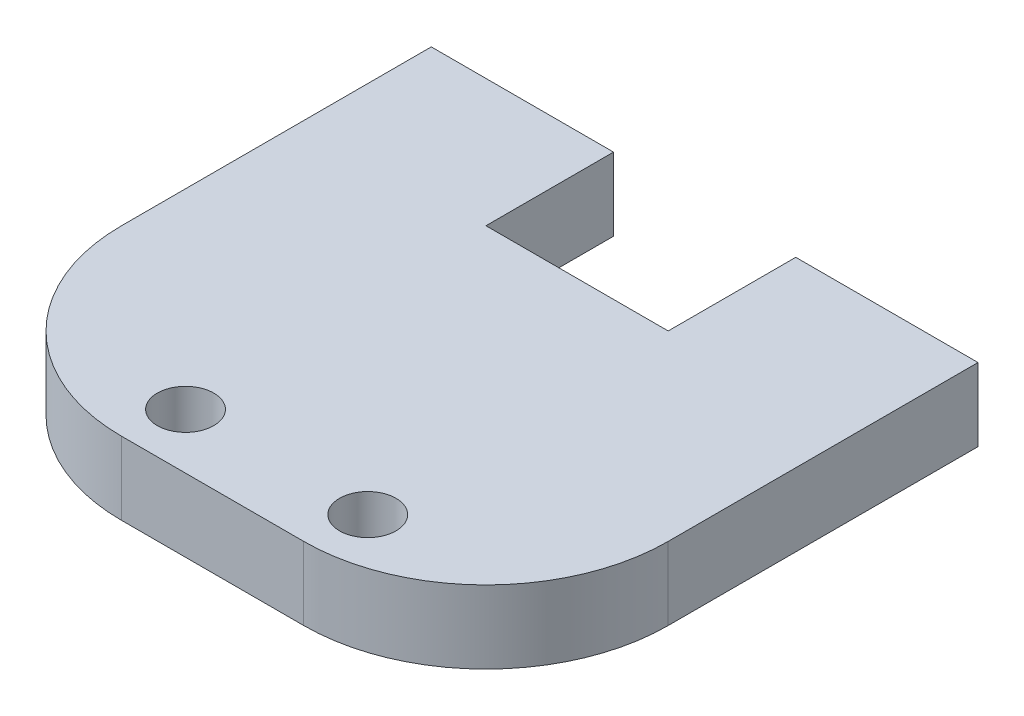
ISO-10303-21;
HEADER;
FILE_DESCRIPTION(('STEP AP214'),'2;1');
FILE_NAME('part.step','',(''),(''),'','','');
FILE_SCHEMA(('AUTOMOTIVE_DESIGN { 1 0 10303 214 1 1 1 1 }'));
ENDSEC;
DATA;
#1=APPLICATION_CONTEXT('core data for automotive mechanical design processes');
#2=APPLICATION_PROTOCOL_DEFINITION('international standard','automotive_design',2000,#1);
#3=PRODUCT_CONTEXT('',#1,'mechanical');
#4=PRODUCT('Part','Part','',(#3));
#5=PRODUCT_RELATED_PRODUCT_CATEGORY('part','',(#4));
#6=PRODUCT_DEFINITION_FORMATION('','',#4);
#7=PRODUCT_DEFINITION_CONTEXT('part definition',#1,'design');
#8=PRODUCT_DEFINITION('design','',#6,#7);
#9=PRODUCT_DEFINITION_SHAPE('','',#8);
#10=(LENGTH_UNIT() NAMED_UNIT(*) SI_UNIT(.MILLI.,.METRE.));
#11=(NAMED_UNIT(*) PLANE_ANGLE_UNIT() SI_UNIT($,.RADIAN.));
#12=(NAMED_UNIT(*) SI_UNIT($,.STERADIAN.) SOLID_ANGLE_UNIT());
#13=UNCERTAINTY_MEASURE_WITH_UNIT(LENGTH_MEASURE(1.E-05),#10,'distance_accuracy_value','');
#14=(GEOMETRIC_REPRESENTATION_CONTEXT(3) GLOBAL_UNCERTAINTY_ASSIGNED_CONTEXT((#13)) GLOBAL_UNIT_ASSIGNED_CONTEXT((#10,
#11,#12)) REPRESENTATION_CONTEXT('',''));
#15=CARTESIAN_POINT('',(0.,0.,0.));
#16=DIRECTION('',(0.,0.,1.));
#17=DIRECTION('',(1.,0.,0.));
#18=AXIS2_PLACEMENT_3D('',#15,#16,#17);
#19=CARTESIAN_POINT('',(-15.,4.,20.));
#20=DIRECTION('',(0.,0.,-1.));
#21=DIRECTION('',(-1.,0.,0.));
#22=AXIS2_PLACEMENT_3D('',#19,#20,#21);
#23=PLANE('',#22);
#24=DIRECTION('',(1.,0.,0.));
#25=VECTOR('',#24,1.);
#26=CARTESIAN_POINT('',(-15.,4.,20.));
#27=LINE('',#26,#25);
#28=CARTESIAN_POINT('',(-5.,4.,20.));
#29=VERTEX_POINT('',#28);
#30=CARTESIAN_POINT('',(4.99999999999999,4.,20.));
#31=VERTEX_POINT('',#30);
#32=EDGE_CURVE('E118',#29,#31,#27,.T.);
#33=ORIENTED_EDGE('',*,*,#32,.F.);
#34=DIRECTION('',(0.,-1.,0.));
#35=VECTOR('',#34,1.);
#36=CARTESIAN_POINT('',(-5.,4.,20.));
#37=LINE('',#36,#35);
#38=CARTESIAN_POINT('',(-5.,0.,20.));
#39=VERTEX_POINT('',#38);
#40=EDGE_CURVE('E176',#29,#39,#37,.T.);
#41=ORIENTED_EDGE('',*,*,#40,.T.);
#42=DIRECTION('',(1.,0.,0.));
#43=VECTOR('',#42,1.);
#44=CARTESIAN_POINT('',(-15.,0.,20.));
#45=LINE('',#44,#43);
#46=CARTESIAN_POINT('',(4.99999999999999,0.,20.));
#47=VERTEX_POINT('',#46);
#48=EDGE_CURVE('E146',#39,#47,#45,.T.);
#49=ORIENTED_EDGE('',*,*,#48,.T.);
#50=DIRECTION('',(0.,-1.,0.));
#51=VECTOR('',#50,1.);
#52=CARTESIAN_POINT('',(5.,4.,20.));
#53=LINE('',#52,#51);
#54=EDGE_CURVE('E127',#47,#31,#53,.F.);
#55=ORIENTED_EDGE('',*,*,#54,.T.);
#56=EDGE_LOOP('',(#33,#41,#49,#55));
#57=FACE_BOUND('',#56,.T.);
#58=ADVANCED_FACE('F32',(#57),#23,.F.);
#59=CARTESIAN_POINT('',(15.,4.,-7.));
#60=DIRECTION('',(-1.,0.,0.));
#61=DIRECTION('',(0.,0.,1.));
#62=AXIS2_PLACEMENT_3D('',#59,#60,#61);
#63=PLANE('',#62);
#64=DIRECTION('',(0.,0.,-1.));
#65=VECTOR('',#64,1.);
#66=CARTESIAN_POINT('',(15.,4.,20.));
#67=LINE('',#66,#65);
#68=CARTESIAN_POINT('',(15.,4.,10.));
#69=VERTEX_POINT('',#68);
#70=CARTESIAN_POINT('',(15.,4.,-7.));
#71=VERTEX_POINT('',#70);
#72=EDGE_CURVE('E110',#69,#71,#67,.T.);
#73=ORIENTED_EDGE('',*,*,#72,.F.);
#74=DIRECTION('',(0.,-1.,0.));
#75=VECTOR('',#74,1.);
#76=CARTESIAN_POINT('',(15.,4.,10.));
#77=LINE('',#76,#75);
#78=CARTESIAN_POINT('',(15.,0.,9.99999999999999));
#79=VERTEX_POINT('',#78);
#80=EDGE_CURVE('E11',#69,#79,#77,.T.);
#81=ORIENTED_EDGE('',*,*,#80,.T.);
#82=DIRECTION('',(0.,0.,-1.));
#83=VECTOR('',#82,1.);
#84=CARTESIAN_POINT('',(15.,0.,-7.));
#85=LINE('',#84,#83);
#86=CARTESIAN_POINT('',(15.,0.,-7.));
#87=VERTEX_POINT('',#86);
#88=EDGE_CURVE('E124',#79,#87,#85,.T.);
#89=ORIENTED_EDGE('',*,*,#88,.T.);
#90=DIRECTION('',(0.,-1.,0.));
#91=VECTOR('',#90,1.);
#92=CARTESIAN_POINT('',(15.,4.,-7.));
#93=LINE('',#92,#91);
#94=EDGE_CURVE('E121',#71,#87,#93,.T.);
#95=ORIENTED_EDGE('',*,*,#94,.F.);
#96=EDGE_LOOP('',(#73,#81,#89,#95));
#97=FACE_BOUND('',#96,.T.);
#98=ADVANCED_FACE('F122',(#97),#63,.F.);
#99=CARTESIAN_POINT('',(5.,4.,-7.));
#100=DIRECTION('',(0.,0.,1.));
#101=DIRECTION('',(1.,0.,0.));
#102=AXIS2_PLACEMENT_3D('',#99,#100,#101);
#103=PLANE('',#102);
#104=DIRECTION('',(-1.,0.,0.));
#105=VECTOR('',#104,1.);
#106=CARTESIAN_POINT('',(5.,0.,-7.));
#107=LINE('',#106,#105);
#108=CARTESIAN_POINT('',(5.,0.,-7.));
#109=VERTEX_POINT('',#108);
#110=EDGE_CURVE('E150',#87,#109,#107,.T.);
#111=ORIENTED_EDGE('',*,*,#110,.T.);
#112=DIRECTION('',(0.,-1.,0.));
#113=VECTOR('',#112,1.);
#114=CARTESIAN_POINT('',(5.,4.,-7.));
#115=LINE('',#114,#113);
#116=CARTESIAN_POINT('',(5.,4.,-7.));
#117=VERTEX_POINT('',#116);
#118=EDGE_CURVE('E128',#117,#109,#115,.T.);
#119=ORIENTED_EDGE('',*,*,#118,.F.);
#120=DIRECTION('',(-1.,0.,0.));
#121=VECTOR('',#120,1.);
#122=CARTESIAN_POINT('',(5.,4.,-7.));
#123=LINE('',#122,#121);
#124=EDGE_CURVE('E114',#71,#117,#123,.T.);
#125=ORIENTED_EDGE('',*,*,#124,.F.);
#126=ORIENTED_EDGE('',*,*,#94,.T.);
#127=EDGE_LOOP('',(#111,#119,#125,#126));
#128=FACE_BOUND('',#127,.T.);
#129=ADVANCED_FACE('F130',(#128),#103,.F.);
#130=CARTESIAN_POINT('',(5.,4.,0.));
#131=DIRECTION('',(1.,0.,0.));
#132=DIRECTION('',(0.,0.,-1.));
#133=AXIS2_PLACEMENT_3D('',#130,#131,#132);
#134=PLANE('',#133);
#135=DIRECTION('',(0.,0.,1.));
#136=VECTOR('',#135,1.);
#137=CARTESIAN_POINT('',(5.,0.,0.));
#138=LINE('',#137,#136);
#139=CARTESIAN_POINT('',(5.,0.,0.));
#140=VERTEX_POINT('',#139);
#141=EDGE_CURVE('E152',#109,#140,#138,.T.);
#142=ORIENTED_EDGE('',*,*,#141,.T.);
#143=DIRECTION('',(0.,-1.,0.));
#144=VECTOR('',#143,1.);
#145=CARTESIAN_POINT('',(5.,4.,0.));
#146=LINE('',#145,#144);
#147=CARTESIAN_POINT('',(5.,4.,0.));
#148=VERTEX_POINT('',#147);
#149=EDGE_CURVE('E171',#148,#140,#146,.T.);
#150=ORIENTED_EDGE('',*,*,#149,.F.);
#151=DIRECTION('',(0.,0.,1.));
#152=VECTOR('',#151,1.);
#153=CARTESIAN_POINT('',(5.,4.,0.));
#154=LINE('',#153,#152);
#155=EDGE_CURVE('E133',#117,#148,#154,.T.);
#156=ORIENTED_EDGE('',*,*,#155,.F.);
#157=ORIENTED_EDGE('',*,*,#118,.T.);
#158=EDGE_LOOP('',(#142,#150,#156,#157));
#159=FACE_BOUND('',#158,.T.);
#160=ADVANCED_FACE('F211',(#159),#134,.F.);
#161=CARTESIAN_POINT('',(-5.,4.,0.));
#162=DIRECTION('',(0.,0.,1.));
#163=DIRECTION('',(1.,0.,0.));
#164=AXIS2_PLACEMENT_3D('',#161,#162,#163);
#165=PLANE('',#164);
#166=DIRECTION('',(-1.,0.,0.));
#167=VECTOR('',#166,1.);
#168=CARTESIAN_POINT('',(-5.,0.,0.));
#169=LINE('',#168,#167);
#170=CARTESIAN_POINT('',(-5.,0.,0.));
#171=VERTEX_POINT('',#170);
#172=EDGE_CURVE('E154',#140,#171,#169,.T.);
#173=ORIENTED_EDGE('',*,*,#172,.T.);
#174=DIRECTION('',(0.,-1.,0.));
#175=VECTOR('',#174,1.);
#176=CARTESIAN_POINT('',(-5.,4.,0.));
#177=LINE('',#176,#175);
#178=CARTESIAN_POINT('',(-5.,4.,0.));
#179=VERTEX_POINT('',#178);
#180=EDGE_CURVE('E168',#179,#171,#177,.T.);
#181=ORIENTED_EDGE('',*,*,#180,.F.);
#182=DIRECTION('',(-1.,0.,0.));
#183=VECTOR('',#182,1.);
#184=CARTESIAN_POINT('',(-5.,4.,0.));
#185=LINE('',#184,#183);
#186=EDGE_CURVE('E135',#148,#179,#185,.T.);
#187=ORIENTED_EDGE('',*,*,#186,.F.);
#188=ORIENTED_EDGE('',*,*,#149,.T.);
#189=EDGE_LOOP('',(#173,#181,#187,#188));
#190=FACE_BOUND('',#189,.T.);
#191=ADVANCED_FACE('F218',(#190),#165,.F.);
#192=CARTESIAN_POINT('',(-5.,4.,-7.));
#193=DIRECTION('',(-1.,0.,0.));
#194=DIRECTION('',(0.,0.,1.));
#195=AXIS2_PLACEMENT_3D('',#192,#193,#194);
#196=PLANE('',#195);
#197=DIRECTION('',(0.,0.,-1.));
#198=VECTOR('',#197,1.);
#199=CARTESIAN_POINT('',(-5.,0.,-7.));
#200=LINE('',#199,#198);
#201=CARTESIAN_POINT('',(-5.,0.,-7.));
#202=VERTEX_POINT('',#201);
#203=EDGE_CURVE('E156',#171,#202,#200,.T.);
#204=ORIENTED_EDGE('',*,*,#203,.T.);
#205=DIRECTION('',(0.,-1.,0.));
#206=VECTOR('',#205,1.);
#207=CARTESIAN_POINT('',(-5.,4.,-7.));
#208=LINE('',#207,#206);
#209=CARTESIAN_POINT('',(-5.,4.,-7.));
#210=VERTEX_POINT('',#209);
#211=EDGE_CURVE('E165',#210,#202,#208,.T.);
#212=ORIENTED_EDGE('',*,*,#211,.F.);
#213=DIRECTION('',(0.,0.,-1.));
#214=VECTOR('',#213,1.);
#215=CARTESIAN_POINT('',(-5.,4.,-7.));
#216=LINE('',#215,#214);
#217=EDGE_CURVE('E140',#179,#210,#216,.T.);
#218=ORIENTED_EDGE('',*,*,#217,.F.);
#219=ORIENTED_EDGE('',*,*,#180,.T.);
#220=EDGE_LOOP('',(#204,#212,#218,#219));
#221=FACE_BOUND('',#220,.T.);
#222=ADVANCED_FACE('F221',(#221),#196,.F.);
#223=CARTESIAN_POINT('',(-15.,4.,-7.));
#224=DIRECTION('',(0.,0.,1.));
#225=DIRECTION('',(1.,0.,0.));
#226=AXIS2_PLACEMENT_3D('',#223,#224,#225);
#227=PLANE('',#226);
#228=DIRECTION('',(-1.,0.,0.));
#229=VECTOR('',#228,1.);
#230=CARTESIAN_POINT('',(-15.,0.,-7.));
#231=LINE('',#230,#229);
#232=CARTESIAN_POINT('',(-15.,0.,-7.));
#233=VERTEX_POINT('',#232);
#234=EDGE_CURVE('E158',#202,#233,#231,.T.);
#235=ORIENTED_EDGE('',*,*,#234,.T.);
#236=DIRECTION('',(0.,-1.,0.));
#237=VECTOR('',#236,1.);
#238=CARTESIAN_POINT('',(-15.,4.,-7.));
#239=LINE('',#238,#237);
#240=CARTESIAN_POINT('',(-15.,4.,-7.));
#241=VERTEX_POINT('',#240);
#242=EDGE_CURVE('E145',#241,#233,#239,.T.);
#243=ORIENTED_EDGE('',*,*,#242,.F.);
#244=DIRECTION('',(-1.,0.,0.));
#245=VECTOR('',#244,1.);
#246=CARTESIAN_POINT('',(-15.,4.,-7.));
#247=LINE('',#246,#245);
#248=EDGE_CURVE('E142',#210,#241,#247,.T.);
#249=ORIENTED_EDGE('',*,*,#248,.F.);
#250=ORIENTED_EDGE('',*,*,#211,.T.);
#251=EDGE_LOOP('',(#235,#243,#249,#250));
#252=FACE_BOUND('',#251,.T.);
#253=ADVANCED_FACE('F226',(#252),#227,.F.);
#254=CARTESIAN_POINT('',(-15.,4.,-4.12584498355111));
#255=DIRECTION('',(1.,0.,0.));
#256=DIRECTION('',(0.,0.,-1.));
#257=AXIS2_PLACEMENT_3D('',#254,#255,#256);
#258=PLANE('',#257);
#259=DIRECTION('',(0.,0.,1.));
#260=VECTOR('',#259,1.);
#261=CARTESIAN_POINT('',(-15.,0.,-4.12584498355111));
#262=LINE('',#261,#260);
#263=CARTESIAN_POINT('',(-15.,0.,10.));
#264=VERTEX_POINT('',#263);
#265=EDGE_CURVE('E160',#233,#264,#262,.T.);
#266=ORIENTED_EDGE('',*,*,#265,.T.);
#267=DIRECTION('',(0.,-1.,0.));
#268=VECTOR('',#267,1.);
#269=CARTESIAN_POINT('',(-15.,4.,10.));
#270=LINE('',#269,#268);
#271=CARTESIAN_POINT('',(-15.,4.,10.));
#272=VERTEX_POINT('',#271);
#273=EDGE_CURVE('E57',#264,#272,#270,.F.);
#274=ORIENTED_EDGE('',*,*,#273,.T.);
#275=DIRECTION('',(0.,0.,1.));
#276=VECTOR('',#275,1.);
#277=CARTESIAN_POINT('',(-15.,4.,-4.12584498355111));
#278=LINE('',#277,#276);
#279=EDGE_CURVE('E162',#241,#272,#278,.T.);
#280=ORIENTED_EDGE('',*,*,#279,.F.);
#281=ORIENTED_EDGE('',*,*,#242,.T.);
#282=EDGE_LOOP('',(#266,#274,#280,#281));
#283=FACE_BOUND('',#282,.T.);
#284=ADVANCED_FACE('F230',(#283),#258,.F.);
#285=CARTESIAN_POINT('',(0.,4.,0.));
#286=DIRECTION('',(0.,1.,0.));
#287=DIRECTION('',(0.,0.,1.));
#288=AXIS2_PLACEMENT_3D('',#285,#286,#287);
#289=PLANE('',#288);
#290=CARTESIAN_POINT('',(5.48350504320972,4.,16.9691258406932));
#291=DIRECTION('',(0.,1.,0.));
#292=DIRECTION('',(0.,0.,1.));
#293=AXIS2_PLACEMENT_3D('',#290,#291,#292);
#294=CIRCLE('',#293,1.55);
#295=CARTESIAN_POINT('',(5.48350504320972,4.,18.5191258406932));
#296=VERTEX_POINT('',#295);
#297=EDGE_CURVE('E187',#296,#296,#294,.T.);
#298=ORIENTED_EDGE('',*,*,#297,.F.);
#299=EDGE_LOOP('',(#298));
#300=FACE_BOUND('',#299,.T.);
#301=CARTESIAN_POINT('',(-4.51649495679028,4.,16.9691258406932));
#302=DIRECTION('',(0.,1.,0.));
#303=DIRECTION('',(0.,0.,1.));
#304=AXIS2_PLACEMENT_3D('',#301,#302,#303);
#305=CIRCLE('',#304,1.55);
#306=CARTESIAN_POINT('',(-4.51649495679028,4.,18.5191258406932));
#307=VERTEX_POINT('',#306);
#308=EDGE_CURVE('E192',#307,#307,#305,.T.);
#309=ORIENTED_EDGE('',*,*,#308,.F.);
#310=EDGE_LOOP('',(#309));
#311=FACE_BOUND('',#310,.T.);
#312=ORIENTED_EDGE('',*,*,#279,.T.);
#313=CARTESIAN_POINT('',(-5.,4.,10.));
#314=DIRECTION('',(0.,1.,0.));
#315=DIRECTION('',(0.,0.,1.));
#316=AXIS2_PLACEMENT_3D('',#313,#314,#315);
#317=CIRCLE('',#316,10.);
#318=EDGE_CURVE('E41',#272,#29,#317,.T.);
#319=ORIENTED_EDGE('',*,*,#318,.T.);
#320=ORIENTED_EDGE('',*,*,#32,.T.);
#321=CARTESIAN_POINT('',(5.,4.,10.));
#322=DIRECTION('',(0.,1.,0.));
#323=DIRECTION('',(0.,0.,1.));
#324=AXIS2_PLACEMENT_3D('',#321,#322,#323);
#325=CIRCLE('',#324,10.);
#326=EDGE_CURVE('E49',#31,#69,#325,.T.);
#327=ORIENTED_EDGE('',*,*,#326,.T.);
#328=ORIENTED_EDGE('',*,*,#72,.T.);
#329=ORIENTED_EDGE('',*,*,#124,.T.);
#330=ORIENTED_EDGE('',*,*,#155,.T.);
#331=ORIENTED_EDGE('',*,*,#186,.T.);
#332=ORIENTED_EDGE('',*,*,#217,.T.);
#333=ORIENTED_EDGE('',*,*,#248,.T.);
#334=EDGE_LOOP('',(#312,#319,#320,#327,#328,#329,#330,#331,#332,#333));
#335=FACE_BOUND('',#334,.T.);
#336=ADVANCED_FACE('F112',(#300,#311,#335),#289,.T.);
#337=CARTESIAN_POINT('',(0.,0.,0.));
#338=DIRECTION('',(0.,1.,0.));
#339=DIRECTION('',(0.,0.,1.));
#340=AXIS2_PLACEMENT_3D('',#337,#338,#339);
#341=PLANE('',#340);
#342=CARTESIAN_POINT('',(5.48350504320972,0.,16.9691258406932));
#343=DIRECTION('',(0.,1.,0.));
#344=DIRECTION('',(0.,0.,1.));
#345=AXIS2_PLACEMENT_3D('',#342,#343,#344);
#346=CIRCLE('',#345,1.55);
#347=CARTESIAN_POINT('',(5.48350504320972,0.,18.5191258406932));
#348=VERTEX_POINT('',#347);
#349=EDGE_CURVE('E36',#348,#348,#346,.T.);
#350=ORIENTED_EDGE('',*,*,#349,.T.);
#351=EDGE_LOOP('',(#350));
#352=FACE_BOUND('',#351,.T.);
#353=CARTESIAN_POINT('',(-4.51649495679028,0.,16.9691258406932));
#354=DIRECTION('',(0.,1.,0.));
#355=DIRECTION('',(0.,0.,1.));
#356=AXIS2_PLACEMENT_3D('',#353,#354,#355);
#357=CIRCLE('',#356,1.55);
#358=CARTESIAN_POINT('',(-4.51649495679028,0.,18.5191258406932));
#359=VERTEX_POINT('',#358);
#360=EDGE_CURVE('E185',#359,#359,#357,.T.);
#361=ORIENTED_EDGE('',*,*,#360,.T.);
#362=EDGE_LOOP('',(#361));
#363=FACE_BOUND('',#362,.T.);
#364=ORIENTED_EDGE('',*,*,#48,.F.);
#365=CARTESIAN_POINT('',(-5.,0.,10.));
#366=DIRECTION('',(0.,1.,0.));
#367=DIRECTION('',(0.,0.,1.));
#368=AXIS2_PLACEMENT_3D('',#365,#366,#367);
#369=CIRCLE('',#368,10.);
#370=EDGE_CURVE('E181',#39,#264,#369,.F.);
#371=ORIENTED_EDGE('',*,*,#370,.T.);
#372=ORIENTED_EDGE('',*,*,#265,.F.);
#373=ORIENTED_EDGE('',*,*,#234,.F.);
#374=ORIENTED_EDGE('',*,*,#203,.F.);
#375=ORIENTED_EDGE('',*,*,#172,.F.);
#376=ORIENTED_EDGE('',*,*,#141,.F.);
#377=ORIENTED_EDGE('',*,*,#110,.F.);
#378=ORIENTED_EDGE('',*,*,#88,.F.);
#379=CARTESIAN_POINT('',(5.,0.,10.));
#380=DIRECTION('',(0.,1.,0.));
#381=DIRECTION('',(0.,0.,1.));
#382=AXIS2_PLACEMENT_3D('',#379,#380,#381);
#383=CIRCLE('',#382,10.);
#384=EDGE_CURVE('E179',#79,#47,#383,.F.);
#385=ORIENTED_EDGE('',*,*,#384,.T.);
#386=EDGE_LOOP('',(#364,#371,#372,#373,#374,#375,#376,#377,#378,#385));
#387=FACE_BOUND('',#386,.T.);
#388=ADVANCED_FACE('F207',(#352,#363,#387),#341,.F.);
#389=CARTESIAN_POINT('',(-5.,4.,10.));
#390=DIRECTION('',(0.,-1.,0.));
#391=DIRECTION('',(0.,0.,-1.));
#392=AXIS2_PLACEMENT_3D('',#389,#390,#391);
#393=CYLINDRICAL_SURFACE('',#392,10.);
#394=ORIENTED_EDGE('',*,*,#318,.F.);
#395=ORIENTED_EDGE('',*,*,#273,.F.);
#396=ORIENTED_EDGE('',*,*,#370,.F.);
#397=ORIENTED_EDGE('',*,*,#40,.F.);
#398=EDGE_LOOP('',(#394,#395,#396,#397));
#399=FACE_BOUND('',#398,.T.);
#400=ADVANCED_FACE('F228',(#399),#393,.T.);
#401=CARTESIAN_POINT('',(5.,4.,10.));
#402=DIRECTION('',(0.,-1.,0.));
#403=DIRECTION('',(0.,0.,-1.));
#404=AXIS2_PLACEMENT_3D('',#401,#402,#403);
#405=CYLINDRICAL_SURFACE('',#404,10.);
#406=ORIENTED_EDGE('',*,*,#326,.F.);
#407=ORIENTED_EDGE('',*,*,#54,.F.);
#408=ORIENTED_EDGE('',*,*,#384,.F.);
#409=ORIENTED_EDGE('',*,*,#80,.F.);
#410=EDGE_LOOP('',(#406,#407,#408,#409));
#411=FACE_BOUND('',#410,.T.);
#412=ADVANCED_FACE('F34',(#411),#405,.T.);
#413=CARTESIAN_POINT('',(-4.51649495679028,-6.,16.9691258406932));
#414=DIRECTION('',(0.,1.,0.));
#415=DIRECTION('',(0.,0.,1.));
#416=AXIS2_PLACEMENT_3D('',#413,#414,#415);
#417=CYLINDRICAL_SURFACE('',#416,1.55);
#418=ORIENTED_EDGE('',*,*,#308,.T.);
#419=EDGE_LOOP('',(#418));
#420=FACE_BOUND('',#419,.T.);
#421=ORIENTED_EDGE('',*,*,#360,.F.);
#422=EDGE_LOOP('',(#421));
#423=FACE_BOUND('',#422,.T.);
#424=ADVANCED_FACE('F253',(#420,#423),#417,.F.);
#425=CARTESIAN_POINT('',(5.48350504320972,-6.,16.9691258406932));
#426=DIRECTION('',(0.,1.,0.));
#427=DIRECTION('',(0.,0.,1.));
#428=AXIS2_PLACEMENT_3D('',#425,#426,#427);
#429=CYLINDRICAL_SURFACE('',#428,1.55);
#430=ORIENTED_EDGE('',*,*,#297,.T.);
#431=EDGE_LOOP('',(#430));
#432=FACE_BOUND('',#431,.T.);
#433=ORIENTED_EDGE('',*,*,#349,.F.);
#434=EDGE_LOOP('',(#433));
#435=FACE_BOUND('',#434,.T.);
#436=ADVANCED_FACE('F260',(#432,#435),#429,.F.);
#437=CLOSED_SHELL('',(#58,#98,#129,#160,#191,#222,#253,#284,#336,#388,#400,#412,#424,#436));
#438=MANIFOLD_SOLID_BREP('B2',#437);
#439=ADVANCED_BREP_SHAPE_REPRESENTATION('',(#18,#438),#14);
#440=SHAPE_DEFINITION_REPRESENTATION(#9,#439);
ENDSEC;
END-ISO-10303-21;
